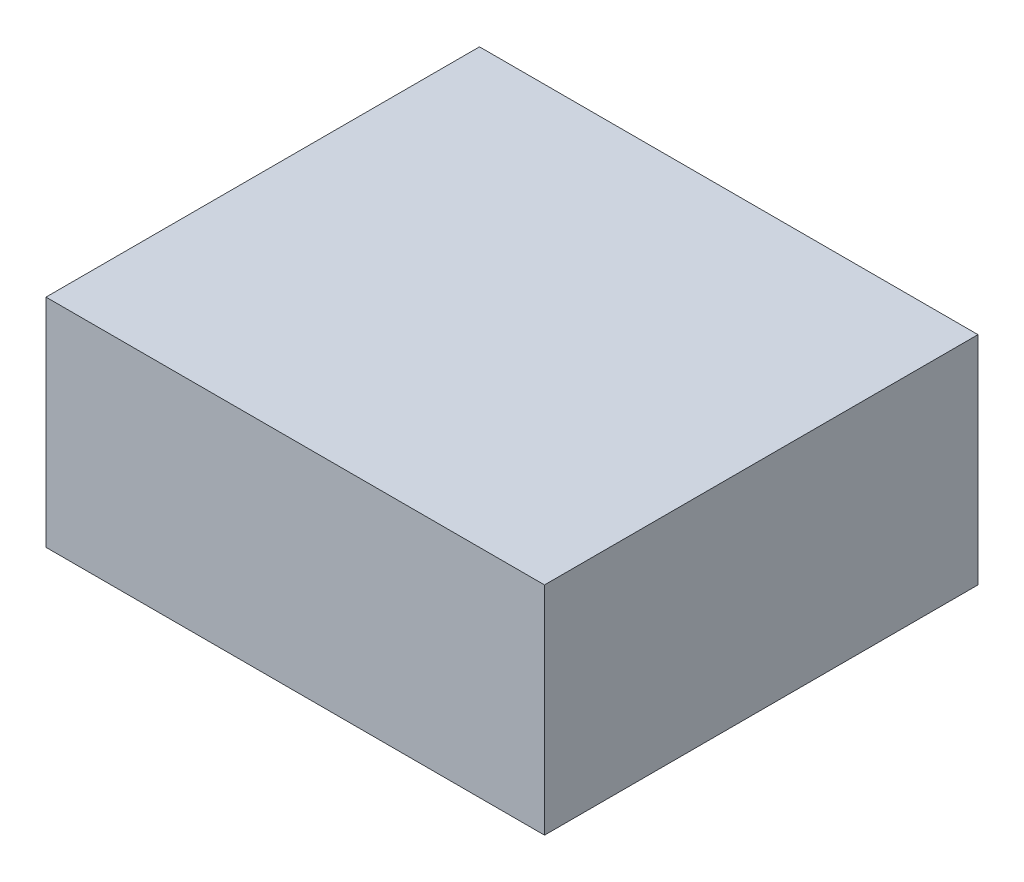
ISO-10303-21;
HEADER;
FILE_DESCRIPTION(('STEP AP214'),'2;1');
FILE_NAME('part.step','',(''),(''),'','','');
FILE_SCHEMA(('AUTOMOTIVE_DESIGN { 1 0 10303 214 1 1 1 1 }'));
ENDSEC;
DATA;
#1=APPLICATION_CONTEXT('core data for automotive mechanical design processes');
#2=APPLICATION_PROTOCOL_DEFINITION('international standard','automotive_design',2000,#1);
#3=PRODUCT_CONTEXT('',#1,'mechanical');
#4=PRODUCT('Part','Part','',(#3));
#5=PRODUCT_RELATED_PRODUCT_CATEGORY('part','',(#4));
#6=PRODUCT_DEFINITION_FORMATION('','',#4);
#7=PRODUCT_DEFINITION_CONTEXT('part definition',#1,'design');
#8=PRODUCT_DEFINITION('design','',#6,#7);
#9=PRODUCT_DEFINITION_SHAPE('','',#8);
#10=(LENGTH_UNIT() NAMED_UNIT(*) SI_UNIT(.MILLI.,.METRE.));
#11=(NAMED_UNIT(*) PLANE_ANGLE_UNIT() SI_UNIT($,.RADIAN.));
#12=(NAMED_UNIT(*) SI_UNIT($,.STERADIAN.) SOLID_ANGLE_UNIT());
#13=UNCERTAINTY_MEASURE_WITH_UNIT(LENGTH_MEASURE(1.E-05),#10,'distance_accuracy_value','');
#14=(GEOMETRIC_REPRESENTATION_CONTEXT(3) GLOBAL_UNCERTAINTY_ASSIGNED_CONTEXT((#13)) GLOBAL_UNIT_ASSIGNED_CONTEXT((#10,
#11,#12)) REPRESENTATION_CONTEXT('',''));
#15=CARTESIAN_POINT('',(0.,0.,0.));
#16=DIRECTION('',(0.,0.,1.));
#17=DIRECTION('',(1.,0.,0.));
#18=AXIS2_PLACEMENT_3D('',#15,#16,#17);
#19=CARTESIAN_POINT('',(0.,10.,0.));
#20=DIRECTION('',(1.,0.,0.));
#21=DIRECTION('',(0.,0.,-1.));
#22=AXIS2_PLACEMENT_3D('',#19,#20,#21);
#23=PLANE('',#22);
#24=DIRECTION('',(0.,0.,1.));
#25=VECTOR('',#24,1.);
#26=CARTESIAN_POINT('',(0.,0.,0.));
#27=LINE('',#26,#25);
#28=CARTESIAN_POINT('',(0.,0.,-20.));
#29=VERTEX_POINT('',#28);
#30=CARTESIAN_POINT('',(0.,0.,0.));
#31=VERTEX_POINT('',#30);
#32=EDGE_CURVE('E106',#29,#31,#27,.T.);
#33=ORIENTED_EDGE('',*,*,#32,.T.);
#34=DIRECTION('',(0.,-1.,0.));
#35=VECTOR('',#34,1.);
#36=CARTESIAN_POINT('',(0.,10.,0.));
#37=LINE('',#36,#35);
#38=CARTESIAN_POINT('',(0.,10.,0.));
#39=VERTEX_POINT('',#38);
#40=EDGE_CURVE('E11',#39,#31,#37,.T.);
#41=ORIENTED_EDGE('',*,*,#40,.F.);
#42=DIRECTION('',(0.,0.,1.));
#43=VECTOR('',#42,1.);
#44=CARTESIAN_POINT('',(0.,10.,0.));
#45=LINE('',#44,#43);
#46=CARTESIAN_POINT('',(0.,10.,-20.));
#47=VERTEX_POINT('',#46);
#48=EDGE_CURVE('E92',#47,#39,#45,.T.);
#49=ORIENTED_EDGE('',*,*,#48,.F.);
#50=DIRECTION('',(0.,-1.,0.));
#51=VECTOR('',#50,1.);
#52=CARTESIAN_POINT('',(0.,10.,-20.));
#53=LINE('',#52,#51);
#54=EDGE_CURVE('E105',#47,#29,#53,.T.);
#55=ORIENTED_EDGE('',*,*,#54,.T.);
#56=EDGE_LOOP('',(#33,#41,#49,#55));
#57=FACE_BOUND('',#56,.T.);
#58=ADVANCED_FACE('F43',(#57),#23,.F.);
#59=CARTESIAN_POINT('',(0.,10.,0.));
#60=DIRECTION('',(0.,0.,-1.));
#61=DIRECTION('',(-1.,0.,0.));
#62=AXIS2_PLACEMENT_3D('',#59,#60,#61);
#63=PLANE('',#62);
#64=DIRECTION('',(1.,0.,0.));
#65=VECTOR('',#64,1.);
#66=CARTESIAN_POINT('',(0.,0.,0.));
#67=LINE('',#66,#65);
#68=CARTESIAN_POINT('',(23.,0.,0.));
#69=VERTEX_POINT('',#68);
#70=EDGE_CURVE('E97',#31,#69,#67,.T.);
#71=ORIENTED_EDGE('',*,*,#70,.T.);
#72=DIRECTION('',(0.,-1.,0.));
#73=VECTOR('',#72,1.);
#74=CARTESIAN_POINT('',(23.,10.,0.));
#75=LINE('',#74,#73);
#76=CARTESIAN_POINT('',(23.,10.,0.));
#77=VERTEX_POINT('',#76);
#78=EDGE_CURVE('E51',#77,#69,#75,.T.);
#79=ORIENTED_EDGE('',*,*,#78,.F.);
#80=DIRECTION('',(1.,0.,0.));
#81=VECTOR('',#80,1.);
#82=CARTESIAN_POINT('',(0.,10.,0.));
#83=LINE('',#82,#81);
#84=EDGE_CURVE('E87',#39,#77,#83,.T.);
#85=ORIENTED_EDGE('',*,*,#84,.F.);
#86=ORIENTED_EDGE('',*,*,#40,.T.);
#87=EDGE_LOOP('',(#71,#79,#85,#86));
#88=FACE_BOUND('',#87,.T.);
#89=ADVANCED_FACE('F100',(#88),#63,.F.);
#90=CARTESIAN_POINT('',(23.,10.,0.));
#91=DIRECTION('',(-1.,0.,0.));
#92=DIRECTION('',(0.,0.,1.));
#93=AXIS2_PLACEMENT_3D('',#90,#91,#92);
#94=PLANE('',#93);
#95=DIRECTION('',(0.,0.,-1.));
#96=VECTOR('',#95,1.);
#97=CARTESIAN_POINT('',(23.,0.,0.));
#98=LINE('',#97,#96);
#99=CARTESIAN_POINT('',(23.,0.,-20.));
#100=VERTEX_POINT('',#99);
#101=EDGE_CURVE('E78',#69,#100,#98,.T.);
#102=ORIENTED_EDGE('',*,*,#101,.T.);
#103=DIRECTION('',(0.,-1.,0.));
#104=VECTOR('',#103,1.);
#105=CARTESIAN_POINT('',(23.,10.,-20.));
#106=LINE('',#105,#104);
#107=CARTESIAN_POINT('',(23.,10.,-20.));
#108=VERTEX_POINT('',#107);
#109=EDGE_CURVE('E98',#108,#100,#106,.T.);
#110=ORIENTED_EDGE('',*,*,#109,.F.);
#111=DIRECTION('',(0.,0.,-1.));
#112=VECTOR('',#111,1.);
#113=CARTESIAN_POINT('',(23.,10.,0.));
#114=LINE('',#113,#112);
#115=EDGE_CURVE('E95',#77,#108,#114,.T.);
#116=ORIENTED_EDGE('',*,*,#115,.F.);
#117=ORIENTED_EDGE('',*,*,#78,.T.);
#118=EDGE_LOOP('',(#102,#110,#116,#117));
#119=FACE_BOUND('',#118,.T.);
#120=ADVANCED_FACE('F99',(#119),#94,.F.);
#121=CARTESIAN_POINT('',(0.,10.,-20.));
#122=DIRECTION('',(0.,0.,1.));
#123=DIRECTION('',(1.,0.,0.));
#124=AXIS2_PLACEMENT_3D('',#121,#122,#123);
#125=PLANE('',#124);
#126=DIRECTION('',(-1.,0.,0.));
#127=VECTOR('',#126,1.);
#128=CARTESIAN_POINT('',(0.,0.,-20.));
#129=LINE('',#128,#127);
#130=EDGE_CURVE('E85',#100,#29,#129,.T.);
#131=ORIENTED_EDGE('',*,*,#130,.T.);
#132=ORIENTED_EDGE('',*,*,#54,.F.);
#133=DIRECTION('',(-1.,0.,0.));
#134=VECTOR('',#133,1.);
#135=CARTESIAN_POINT('',(0.,10.,-20.));
#136=LINE('',#135,#134);
#137=EDGE_CURVE('E56',#108,#47,#136,.T.);
#138=ORIENTED_EDGE('',*,*,#137,.F.);
#139=ORIENTED_EDGE('',*,*,#109,.T.);
#140=EDGE_LOOP('',(#131,#132,#138,#139));
#141=FACE_BOUND('',#140,.T.);
#142=ADVANCED_FACE('F111',(#141),#125,.F.);
#143=CARTESIAN_POINT('',(0.,10.,0.));
#144=DIRECTION('',(0.,-1.,0.));
#145=DIRECTION('',(0.,0.,-1.));
#146=AXIS2_PLACEMENT_3D('',#143,#144,#145);
#147=PLANE('',#146);
#148=ORIENTED_EDGE('',*,*,#48,.T.);
#149=ORIENTED_EDGE('',*,*,#84,.T.);
#150=ORIENTED_EDGE('',*,*,#115,.T.);
#151=ORIENTED_EDGE('',*,*,#137,.T.);
#152=EDGE_LOOP('',(#148,#149,#150,#151));
#153=FACE_BOUND('',#152,.T.);
#154=ADVANCED_FACE('F89',(#153),#147,.F.);
#155=CARTESIAN_POINT('',(0.,0.,0.));
#156=DIRECTION('',(0.,-1.,0.));
#157=DIRECTION('',(0.,0.,-1.));
#158=AXIS2_PLACEMENT_3D('',#155,#156,#157);
#159=PLANE('',#158);
#160=ORIENTED_EDGE('',*,*,#32,.F.);
#161=ORIENTED_EDGE('',*,*,#130,.F.);
#162=ORIENTED_EDGE('',*,*,#101,.F.);
#163=ORIENTED_EDGE('',*,*,#70,.F.);
#164=EDGE_LOOP('',(#160,#161,#162,#163));
#165=FACE_BOUND('',#164,.T.);
#166=ADVANCED_FACE('F116',(#165),#159,.T.);
#167=CLOSED_SHELL('',(#58,#89,#120,#142,#154,#166));
#168=MANIFOLD_SOLID_BREP('B2',#167);
#169=ADVANCED_BREP_SHAPE_REPRESENTATION('',(#18,#168),#14);
#170=SHAPE_DEFINITION_REPRESENTATION(#9,#169);
ENDSEC;
END-ISO-10303-21;
